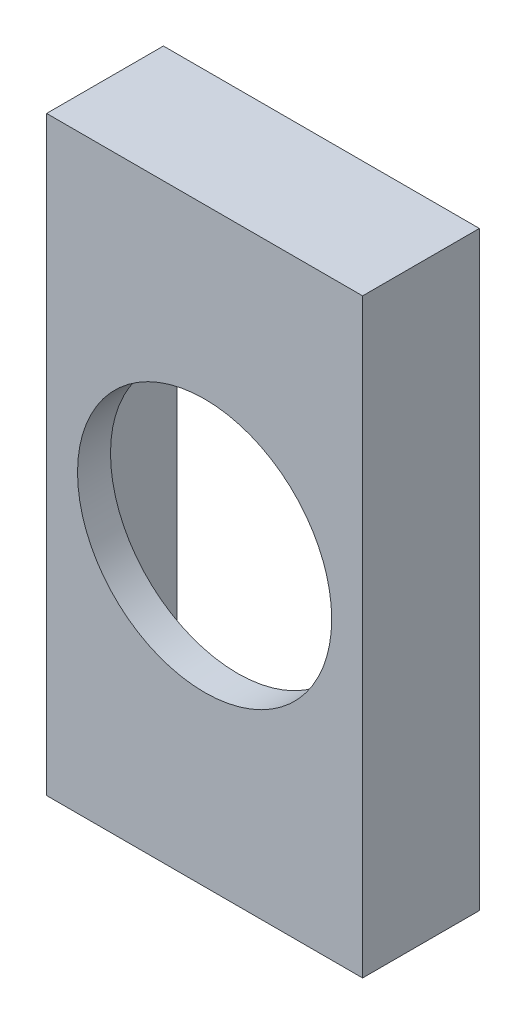
ISO-10303-21;
HEADER;
FILE_DESCRIPTION(('STEP AP214'),'2;1');
FILE_NAME('part.step','',(''),(''),'','','');
FILE_SCHEMA(('AUTOMOTIVE_DESIGN { 1 0 10303 214 1 1 1 1 }'));
ENDSEC;
DATA;
#1=APPLICATION_CONTEXT('core data for automotive mechanical design processes');
#2=APPLICATION_PROTOCOL_DEFINITION('international standard','automotive_design',2000,#1);
#3=PRODUCT_CONTEXT('',#1,'mechanical');
#4=PRODUCT('Part','Part','',(#3));
#5=PRODUCT_RELATED_PRODUCT_CATEGORY('part','',(#4));
#6=PRODUCT_DEFINITION_FORMATION('','',#4);
#7=PRODUCT_DEFINITION_CONTEXT('part definition',#1,'design');
#8=PRODUCT_DEFINITION('design','',#6,#7);
#9=PRODUCT_DEFINITION_SHAPE('','',#8);
#10=(LENGTH_UNIT() NAMED_UNIT(*) SI_UNIT(.MILLI.,.METRE.));
#11=(NAMED_UNIT(*) PLANE_ANGLE_UNIT() SI_UNIT($,.RADIAN.));
#12=(NAMED_UNIT(*) SI_UNIT($,.STERADIAN.) SOLID_ANGLE_UNIT());
#13=UNCERTAINTY_MEASURE_WITH_UNIT(LENGTH_MEASURE(1.E-05),#10,'distance_accuracy_value','');
#14=(GEOMETRIC_REPRESENTATION_CONTEXT(3) GLOBAL_UNCERTAINTY_ASSIGNED_CONTEXT((#13)) GLOBAL_UNIT_ASSIGNED_CONTEXT((#10,
#11,#12)) REPRESENTATION_CONTEXT('',''));
#15=CARTESIAN_POINT('',(0.,0.,0.));
#16=DIRECTION('',(0.,0.,1.));
#17=DIRECTION('',(1.,0.,0.));
#18=AXIS2_PLACEMENT_3D('',#15,#16,#17);
#19=CARTESIAN_POINT('',(11.5,-21.5,8.5));
#20=DIRECTION('',(-1.,0.,0.));
#21=DIRECTION('',(0.,0.,1.));
#22=AXIS2_PLACEMENT_3D('',#19,#20,#21);
#23=PLANE('',#22);
#24=DIRECTION('',(0.,1.,0.));
#25=VECTOR('',#24,1.);
#26=CARTESIAN_POINT('',(11.5,-21.5,0.));
#27=LINE('',#26,#25);
#28=CARTESIAN_POINT('',(11.5,-21.5,0.));
#29=VERTEX_POINT('',#28);
#30=CARTESIAN_POINT('',(11.5,21.5,0.));
#31=VERTEX_POINT('',#30);
#32=EDGE_CURVE('E162',#29,#31,#27,.T.);
#33=ORIENTED_EDGE('',*,*,#32,.T.);
#34=DIRECTION('',(0.,0.,-1.));
#35=VECTOR('',#34,1.);
#36=CARTESIAN_POINT('',(11.5,21.5,8.5));
#37=LINE('',#36,#35);
#38=CARTESIAN_POINT('',(11.5,21.5,8.5));
#39=VERTEX_POINT('',#38);
#40=EDGE_CURVE('E12',#39,#31,#37,.T.);
#41=ORIENTED_EDGE('',*,*,#40,.F.);
#42=DIRECTION('',(0.,1.,0.));
#43=VECTOR('',#42,1.);
#44=CARTESIAN_POINT('',(11.5,-21.5,8.5));
#45=LINE('',#44,#43);
#46=CARTESIAN_POINT('',(11.5,-21.5,8.5));
#47=VERTEX_POINT('',#46);
#48=EDGE_CURVE('E164',#47,#39,#45,.T.);
#49=ORIENTED_EDGE('',*,*,#48,.F.);
#50=DIRECTION('',(0.,0.,-1.));
#51=VECTOR('',#50,1.);
#52=CARTESIAN_POINT('',(11.5,-21.5,8.5));
#53=LINE('',#52,#51);
#54=EDGE_CURVE('E174',#47,#29,#53,.T.);
#55=ORIENTED_EDGE('',*,*,#54,.T.);
#56=EDGE_LOOP('',(#33,#41,#49,#55));
#57=FACE_BOUND('',#56,.T.);
#58=ADVANCED_FACE('F45',(#57),#23,.F.);
#59=CARTESIAN_POINT('',(-11.5,21.5,8.5));
#60=DIRECTION('',(0.,-1.,0.));
#61=DIRECTION('',(0.,0.,-1.));
#62=AXIS2_PLACEMENT_3D('',#59,#60,#61);
#63=PLANE('',#62);
#64=DIRECTION('',(-1.,0.,0.));
#65=VECTOR('',#64,1.);
#66=CARTESIAN_POINT('',(-11.5,21.5,0.));
#67=LINE('',#66,#65);
#68=CARTESIAN_POINT('',(-11.5,21.5,0.));
#69=VERTEX_POINT('',#68);
#70=EDGE_CURVE('E178',#31,#69,#67,.T.);
#71=ORIENTED_EDGE('',*,*,#70,.T.);
#72=DIRECTION('',(0.,0.,-1.));
#73=VECTOR('',#72,1.);
#74=CARTESIAN_POINT('',(-11.5,21.5,8.5));
#75=LINE('',#74,#73);
#76=CARTESIAN_POINT('',(-11.5,21.5,8.5));
#77=VERTEX_POINT('',#76);
#78=EDGE_CURVE('E54',#77,#69,#75,.T.);
#79=ORIENTED_EDGE('',*,*,#78,.F.);
#80=DIRECTION('',(-1.,0.,0.));
#81=VECTOR('',#80,1.);
#82=CARTESIAN_POINT('',(-11.5,21.5,8.5));
#83=LINE('',#82,#81);
#84=EDGE_CURVE('E98',#39,#77,#83,.T.);
#85=ORIENTED_EDGE('',*,*,#84,.F.);
#86=ORIENTED_EDGE('',*,*,#40,.T.);
#87=EDGE_LOOP('',(#71,#79,#85,#86));
#88=FACE_BOUND('',#87,.T.);
#89=ADVANCED_FACE('F212',(#88),#63,.F.);
#90=CARTESIAN_POINT('',(-11.5,-21.5,8.5));
#91=DIRECTION('',(1.,0.,0.));
#92=DIRECTION('',(0.,0.,-1.));
#93=AXIS2_PLACEMENT_3D('',#90,#91,#92);
#94=PLANE('',#93);
#95=DIRECTION('',(0.,-1.,0.));
#96=VECTOR('',#95,1.);
#97=CARTESIAN_POINT('',(-11.5,-21.5,0.));
#98=LINE('',#97,#96);
#99=CARTESIAN_POINT('',(-11.5,-21.5,0.));
#100=VERTEX_POINT('',#99);
#101=EDGE_CURVE('E181',#69,#100,#98,.T.);
#102=ORIENTED_EDGE('',*,*,#101,.T.);
#103=DIRECTION('',(0.,0.,-1.));
#104=VECTOR('',#103,1.);
#105=CARTESIAN_POINT('',(-11.5,-21.5,8.5));
#106=LINE('',#105,#104);
#107=CARTESIAN_POINT('',(-11.5,-21.5,8.5));
#108=VERTEX_POINT('',#107);
#109=EDGE_CURVE('E188',#108,#100,#106,.T.);
#110=ORIENTED_EDGE('',*,*,#109,.F.);
#111=DIRECTION('',(0.,-1.,0.));
#112=VECTOR('',#111,1.);
#113=CARTESIAN_POINT('',(-11.5,-21.5,8.5));
#114=LINE('',#113,#112);
#115=EDGE_CURVE('E169',#77,#108,#114,.T.);
#116=ORIENTED_EDGE('',*,*,#115,.F.);
#117=ORIENTED_EDGE('',*,*,#78,.T.);
#118=EDGE_LOOP('',(#102,#110,#116,#117));
#119=FACE_BOUND('',#118,.T.);
#120=ADVANCED_FACE('F196',(#119),#94,.F.);
#121=CARTESIAN_POINT('',(-11.5,-21.5,8.5));
#122=DIRECTION('',(0.,1.,0.));
#123=DIRECTION('',(0.,0.,1.));
#124=AXIS2_PLACEMENT_3D('',#121,#122,#123);
#125=PLANE('',#124);
#126=DIRECTION('',(1.,0.,0.));
#127=VECTOR('',#126,1.);
#128=CARTESIAN_POINT('',(-11.5,-21.5,0.));
#129=LINE('',#128,#127);
#130=EDGE_CURVE('E91',#100,#29,#129,.T.);
#131=ORIENTED_EDGE('',*,*,#130,.T.);
#132=ORIENTED_EDGE('',*,*,#54,.F.);
#133=DIRECTION('',(1.,0.,0.));
#134=VECTOR('',#133,1.);
#135=CARTESIAN_POINT('',(-11.5,-21.5,8.5));
#136=LINE('',#135,#134);
#137=EDGE_CURVE('E70',#108,#47,#136,.T.);
#138=ORIENTED_EDGE('',*,*,#137,.F.);
#139=ORIENTED_EDGE('',*,*,#109,.T.);
#140=EDGE_LOOP('',(#131,#132,#138,#139));
#141=FACE_BOUND('',#140,.T.);
#142=ADVANCED_FACE('F202',(#141),#125,.F.);
#143=CARTESIAN_POINT('',(0.,0.,8.5));
#144=DIRECTION('',(0.,0.,-1.));
#145=DIRECTION('',(-1.,0.,0.));
#146=AXIS2_PLACEMENT_3D('',#143,#144,#145);
#147=PLANE('',#146);
#148=CARTESIAN_POINT('',(0.,0.,8.5));
#149=DIRECTION('',(0.,0.,1.));
#150=DIRECTION('',(1.,0.,0.));
#151=AXIS2_PLACEMENT_3D('',#148,#149,#150);
#152=CIRCLE('',#151,9.25);
#153=CARTESIAN_POINT('',(9.25,0.,8.5));
#154=VERTEX_POINT('',#153);
#155=EDGE_CURVE('E384',#154,#154,#152,.T.);
#156=ORIENTED_EDGE('',*,*,#155,.F.);
#157=EDGE_LOOP('',(#156));
#158=FACE_BOUND('',#157,.T.);
#159=ORIENTED_EDGE('',*,*,#48,.T.);
#160=ORIENTED_EDGE('',*,*,#84,.T.);
#161=ORIENTED_EDGE('',*,*,#115,.T.);
#162=ORIENTED_EDGE('',*,*,#137,.T.);
#163=EDGE_LOOP('',(#159,#160,#161,#162));
#164=FACE_BOUND('',#163,.T.);
#165=ADVANCED_FACE('F204',(#158,#164),#147,.F.);
#166=CARTESIAN_POINT('',(0.,0.,0.));
#167=DIRECTION('',(0.,0.,-1.));
#168=DIRECTION('',(-1.,0.,0.));
#169=AXIS2_PLACEMENT_3D('',#166,#167,#168);
#170=PLANE('',#169);
#171=CARTESIAN_POINT('',(0.,19.,0.));
#172=DIRECTION('',(0.,0.,-1.));
#173=DIRECTION('',(-1.,0.,0.));
#174=AXIS2_PLACEMENT_3D('',#171,#172,#173);
#175=CIRCLE('',#174,1.);
#176=CARTESIAN_POINT('',(-1.,19.,0.));
#177=VERTEX_POINT('',#176);
#178=EDGE_CURVE('E385',#177,#177,#175,.T.);
#179=ORIENTED_EDGE('',*,*,#178,.F.);
#180=EDGE_LOOP('',(#179));
#181=FACE_BOUND('',#180,.T.);
#182=CARTESIAN_POINT('',(0.,-19.,0.));
#183=DIRECTION('',(0.,0.,-1.));
#184=DIRECTION('',(1.,0.,0.));
#185=AXIS2_PLACEMENT_3D('',#182,#183,#184);
#186=CIRCLE('',#185,1.);
#187=CARTESIAN_POINT('',(0.999999999999999,-19.,0.));
#188=VERTEX_POINT('',#187);
#189=EDGE_CURVE('E392',#188,#188,#186,.T.);
#190=ORIENTED_EDGE('',*,*,#189,.F.);
#191=EDGE_LOOP('',(#190));
#192=FACE_BOUND('',#191,.T.);
#193=DIRECTION('',(0.,1.,0.));
#194=VECTOR('',#193,1.);
#195=CARTESIAN_POINT('',(-10.5,-16.5,0.));
#196=LINE('',#195,#194);
#197=CARTESIAN_POINT('',(-10.5,-16.5,0.));
#198=VERTEX_POINT('',#197);
#199=CARTESIAN_POINT('',(-10.5,16.5,0.));
#200=VERTEX_POINT('',#199);
#201=EDGE_CURVE('E61',#198,#200,#196,.T.);
#202=ORIENTED_EDGE('',*,*,#201,.F.);
#203=DIRECTION('',(-1.,0.,0.));
#204=VECTOR('',#203,1.);
#205=CARTESIAN_POINT('',(10.5,-16.5,0.));
#206=LINE('',#205,#204);
#207=CARTESIAN_POINT('',(10.5,-16.5,0.));
#208=VERTEX_POINT('',#207);
#209=EDGE_CURVE('E145',#208,#198,#206,.T.);
#210=ORIENTED_EDGE('',*,*,#209,.F.);
#211=DIRECTION('',(0.,-1.,0.));
#212=VECTOR('',#211,1.);
#213=CARTESIAN_POINT('',(10.5,-16.5,0.));
#214=LINE('',#213,#212);
#215=CARTESIAN_POINT('',(10.5,16.5,0.));
#216=VERTEX_POINT('',#215);
#217=EDGE_CURVE('E126',#216,#208,#214,.T.);
#218=ORIENTED_EDGE('',*,*,#217,.F.);
#219=DIRECTION('',(1.,0.,0.));
#220=VECTOR('',#219,1.);
#221=CARTESIAN_POINT('',(10.5,16.5,0.));
#222=LINE('',#221,#220);
#223=EDGE_CURVE('E137',#200,#216,#222,.T.);
#224=ORIENTED_EDGE('',*,*,#223,.F.);
#225=EDGE_LOOP('',(#202,#210,#218,#224));
#226=FACE_BOUND('',#225,.T.);
#227=ORIENTED_EDGE('',*,*,#32,.F.);
#228=ORIENTED_EDGE('',*,*,#130,.F.);
#229=ORIENTED_EDGE('',*,*,#101,.F.);
#230=ORIENTED_EDGE('',*,*,#70,.F.);
#231=EDGE_LOOP('',(#227,#228,#229,#230));
#232=FACE_BOUND('',#231,.T.);
#233=ADVANCED_FACE('F142',(#181,#192,#226,#232),#170,.T.);
#234=CARTESIAN_POINT('',(-10.5,-16.5,47.6152144312159));
#235=DIRECTION('',(-1.,0.,0.));
#236=DIRECTION('',(0.,0.,1.));
#237=AXIS2_PLACEMENT_3D('',#234,#235,#236);
#238=PLANE('',#237);
#239=DIRECTION('',(0.,-1.,0.));
#240=VECTOR('',#239,1.);
#241=CARTESIAN_POINT('',(-10.5,-16.5,6.1));
#242=LINE('',#241,#240);
#243=CARTESIAN_POINT('',(-10.5,16.5,6.1));
#244=VERTEX_POINT('',#243);
#245=CARTESIAN_POINT('',(-10.5,-16.5,6.1));
#246=VERTEX_POINT('',#245);
#247=EDGE_CURVE('E163',#244,#246,#242,.T.);
#248=ORIENTED_EDGE('',*,*,#247,.T.);
#249=DIRECTION('',(0.,0.,-1.));
#250=VECTOR('',#249,1.);
#251=CARTESIAN_POINT('',(-10.5,-16.5,47.6152144312159));
#252=LINE('',#251,#250);
#253=EDGE_CURVE('E152',#246,#198,#252,.T.);
#254=ORIENTED_EDGE('',*,*,#253,.T.);
#255=ORIENTED_EDGE('',*,*,#201,.T.);
#256=DIRECTION('',(0.,0.,-1.));
#257=VECTOR('',#256,1.);
#258=CARTESIAN_POINT('',(-10.5,16.5,47.6152144312159));
#259=LINE('',#258,#257);
#260=EDGE_CURVE('E134',#244,#200,#259,.T.);
#261=ORIENTED_EDGE('',*,*,#260,.F.);
#262=EDGE_LOOP('',(#248,#254,#255,#261));
#263=FACE_BOUND('',#262,.T.);
#264=ADVANCED_FACE('F237',(#263),#238,.F.);
#265=CARTESIAN_POINT('',(10.5,-16.5,47.6152144312159));
#266=DIRECTION('',(0.,-1.,0.));
#267=DIRECTION('',(0.,0.,-1.));
#268=AXIS2_PLACEMENT_3D('',#265,#266,#267);
#269=PLANE('',#268);
#270=DIRECTION('',(1.,0.,0.));
#271=VECTOR('',#270,1.);
#272=CARTESIAN_POINT('',(10.5,-16.5,6.1));
#273=LINE('',#272,#271);
#274=CARTESIAN_POINT('',(10.5,-16.5,6.1));
#275=VERTEX_POINT('',#274);
#276=EDGE_CURVE('E404',#246,#275,#273,.T.);
#277=ORIENTED_EDGE('',*,*,#276,.T.);
#278=DIRECTION('',(0.,0.,-1.));
#279=VECTOR('',#278,1.);
#280=CARTESIAN_POINT('',(10.5,-16.5,47.6152144312159));
#281=LINE('',#280,#279);
#282=EDGE_CURVE('E133',#275,#208,#281,.T.);
#283=ORIENTED_EDGE('',*,*,#282,.T.);
#284=ORIENTED_EDGE('',*,*,#209,.T.);
#285=ORIENTED_EDGE('',*,*,#253,.F.);
#286=EDGE_LOOP('',(#277,#283,#284,#285));
#287=FACE_BOUND('',#286,.T.);
#288=ADVANCED_FACE('F242',(#287),#269,.F.);
#289=CARTESIAN_POINT('',(10.5,-16.5,47.6152144312159));
#290=DIRECTION('',(1.,0.,0.));
#291=DIRECTION('',(0.,0.,-1.));
#292=AXIS2_PLACEMENT_3D('',#289,#290,#291);
#293=PLANE('',#292);
#294=DIRECTION('',(0.,1.,0.));
#295=VECTOR('',#294,1.);
#296=CARTESIAN_POINT('',(10.5,-16.5,6.1));
#297=LINE('',#296,#295);
#298=CARTESIAN_POINT('',(10.5,16.5,6.1));
#299=VERTEX_POINT('',#298);
#300=EDGE_CURVE('E129',#275,#299,#297,.T.);
#301=ORIENTED_EDGE('',*,*,#300,.T.);
#302=DIRECTION('',(0.,0.,-1.));
#303=VECTOR('',#302,1.);
#304=CARTESIAN_POINT('',(10.5,16.5,47.6152144312159));
#305=LINE('',#304,#303);
#306=EDGE_CURVE('E121',#299,#216,#305,.T.);
#307=ORIENTED_EDGE('',*,*,#306,.T.);
#308=ORIENTED_EDGE('',*,*,#217,.T.);
#309=ORIENTED_EDGE('',*,*,#282,.F.);
#310=EDGE_LOOP('',(#301,#307,#308,#309));
#311=FACE_BOUND('',#310,.T.);
#312=ADVANCED_FACE('F123',(#311),#293,.F.);
#313=CARTESIAN_POINT('',(10.5,16.5,47.6152144312159));
#314=DIRECTION('',(0.,1.,0.));
#315=DIRECTION('',(0.,0.,1.));
#316=AXIS2_PLACEMENT_3D('',#313,#314,#315);
#317=PLANE('',#316);
#318=DIRECTION('',(-1.,0.,0.));
#319=VECTOR('',#318,1.);
#320=CARTESIAN_POINT('',(10.5,16.5,6.1));
#321=LINE('',#320,#319);
#322=EDGE_CURVE('E159',#299,#244,#321,.T.);
#323=ORIENTED_EDGE('',*,*,#322,.T.);
#324=ORIENTED_EDGE('',*,*,#260,.T.);
#325=ORIENTED_EDGE('',*,*,#223,.T.);
#326=ORIENTED_EDGE('',*,*,#306,.F.);
#327=EDGE_LOOP('',(#323,#324,#325,#326));
#328=FACE_BOUND('',#327,.T.);
#329=ADVANCED_FACE('F138',(#328),#317,.F.);
#330=CARTESIAN_POINT('',(0.,0.,6.1));
#331=DIRECTION('',(0.,0.,-1.));
#332=DIRECTION('',(-1.,0.,0.));
#333=AXIS2_PLACEMENT_3D('',#330,#331,#332);
#334=PLANE('',#333);
#335=CARTESIAN_POINT('',(0.,0.,6.1));
#336=DIRECTION('',(0.,0.,-1.));
#337=DIRECTION('',(-1.,0.,0.));
#338=AXIS2_PLACEMENT_3D('',#335,#336,#337);
#339=CIRCLE('',#338,9.25);
#340=CARTESIAN_POINT('',(-9.25,0.,6.1));
#341=VERTEX_POINT('',#340);
#342=EDGE_CURVE('E48',#341,#341,#339,.T.);
#343=ORIENTED_EDGE('',*,*,#342,.F.);
#344=EDGE_LOOP('',(#343));
#345=FACE_BOUND('',#344,.T.);
#346=ORIENTED_EDGE('',*,*,#247,.F.);
#347=ORIENTED_EDGE('',*,*,#322,.F.);
#348=ORIENTED_EDGE('',*,*,#300,.F.);
#349=ORIENTED_EDGE('',*,*,#276,.F.);
#350=EDGE_LOOP('',(#346,#347,#348,#349));
#351=FACE_BOUND('',#350,.T.);
#352=ADVANCED_FACE('F273',(#345,#351),#334,.T.);
#353=CARTESIAN_POINT('',(0.,0.,0.));
#354=DIRECTION('',(0.,0.,1.));
#355=DIRECTION('',(1.,0.,0.));
#356=AXIS2_PLACEMENT_3D('',#353,#354,#355);
#357=CYLINDRICAL_SURFACE('',#356,9.25);
#358=ORIENTED_EDGE('',*,*,#342,.T.);
#359=EDGE_LOOP('',(#358));
#360=FACE_BOUND('',#359,.T.);
#361=ORIENTED_EDGE('',*,*,#155,.T.);
#362=EDGE_LOOP('',(#361));
#363=FACE_BOUND('',#362,.T.);
#364=ADVANCED_FACE('F289',(#360,#363),#357,.F.);
#365=CARTESIAN_POINT('',(0.,-19.,4.));
#366=DIRECTION('',(0.,0.,-1.));
#367=DIRECTION('',(-1.,0.,0.));
#368=AXIS2_PLACEMENT_3D('',#365,#366,#367);
#369=CYLINDRICAL_SURFACE('',#368,1.);
#370=CARTESIAN_POINT('',(0.,-19.,4.));
#371=DIRECTION('',(0.,0.,-1.));
#372=DIRECTION('',(1.,0.,0.));
#373=AXIS2_PLACEMENT_3D('',#370,#371,#372);
#374=CIRCLE('',#373,1.);
#375=CARTESIAN_POINT('',(0.999999999999999,-19.,4.));
#376=VERTEX_POINT('',#375);
#377=EDGE_CURVE('E398',#376,#376,#374,.T.);
#378=ORIENTED_EDGE('',*,*,#377,.F.);
#379=EDGE_LOOP('',(#378));
#380=FACE_BOUND('',#379,.T.);
#381=ORIENTED_EDGE('',*,*,#189,.T.);
#382=EDGE_LOOP('',(#381));
#383=FACE_BOUND('',#382,.T.);
#384=ADVANCED_FACE('F300',(#380,#383),#369,.F.);
#385=CARTESIAN_POINT('',(0.,-19.,4.));
#386=DIRECTION('',(0.,0.,1.));
#387=DIRECTION('',(1.,0.,0.));
#388=AXIS2_PLACEMENT_3D('',#385,#386,#387);
#389=PLANE('',#388);
#390=ORIENTED_EDGE('',*,*,#377,.T.);
#391=EDGE_LOOP('',(#390));
#392=FACE_BOUND('',#391,.T.);
#393=ADVANCED_FACE('F318',(#392),#389,.F.);
#394=CARTESIAN_POINT('',(0.,19.,4.));
#395=DIRECTION('',(0.,0.,-1.));
#396=DIRECTION('',(-1.,0.,0.));
#397=AXIS2_PLACEMENT_3D('',#394,#395,#396);
#398=CYLINDRICAL_SURFACE('',#397,1.);
#399=CARTESIAN_POINT('',(0.,19.,4.));
#400=DIRECTION('',(0.,0.,-1.));
#401=DIRECTION('',(-1.,0.,0.));
#402=AXIS2_PLACEMENT_3D('',#399,#400,#401);
#403=CIRCLE('',#402,1.);
#404=CARTESIAN_POINT('',(-1.,19.,4.));
#405=VERTEX_POINT('',#404);
#406=EDGE_CURVE('E382',#405,#405,#403,.T.);
#407=ORIENTED_EDGE('',*,*,#406,.F.);
#408=EDGE_LOOP('',(#407));
#409=FACE_BOUND('',#408,.T.);
#410=ORIENTED_EDGE('',*,*,#178,.T.);
#411=EDGE_LOOP('',(#410));
#412=FACE_BOUND('',#411,.T.);
#413=ADVANCED_FACE('F329',(#409,#412),#398,.F.);
#414=CARTESIAN_POINT('',(0.,19.,4.));
#415=DIRECTION('',(0.,0.,-1.));
#416=DIRECTION('',(-1.,0.,0.));
#417=AXIS2_PLACEMENT_3D('',#414,#415,#416);
#418=PLANE('',#417);
#419=ORIENTED_EDGE('',*,*,#406,.T.);
#420=EDGE_LOOP('',(#419));
#421=FACE_BOUND('',#420,.T.);
#422=ADVANCED_FACE('F340',(#421),#418,.T.);
#423=CLOSED_SHELL('',(#58,#89,#120,#142,#165,#233,#264,#288,#312,#329,#352,#364,#384,#393,#413,#422));
#424=MANIFOLD_SOLID_BREP('B2',#423);
#425=ADVANCED_BREP_SHAPE_REPRESENTATION('',(#18,#424),#14);
#426=SHAPE_DEFINITION_REPRESENTATION(#9,#425);
ENDSEC;
END-ISO-10303-21;
